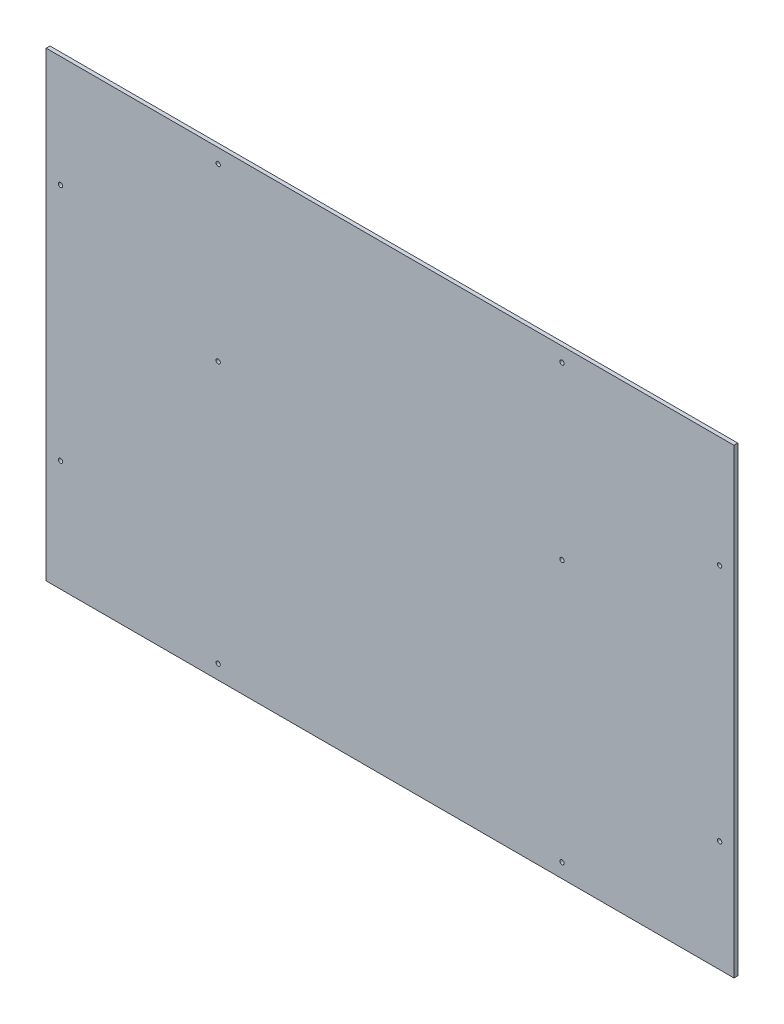
ISO-10303-21;
HEADER;
FILE_DESCRIPTION(('STEP AP214'),'2;1');
FILE_NAME('part.step','',(''),(''),'','','');
FILE_SCHEMA(('AUTOMOTIVE_DESIGN { 1 0 10303 214 1 1 1 1 }'));
ENDSEC;
DATA;
#1=APPLICATION_CONTEXT('core data for automotive mechanical design processes');
#2=APPLICATION_PROTOCOL_DEFINITION('international standard','automotive_design',2000,#1);
#3=PRODUCT_CONTEXT('',#1,'mechanical');
#4=PRODUCT('Part','Part','',(#3));
#5=PRODUCT_RELATED_PRODUCT_CATEGORY('part','',(#4));
#6=PRODUCT_DEFINITION_FORMATION('','',#4);
#7=PRODUCT_DEFINITION_CONTEXT('part definition',#1,'design');
#8=PRODUCT_DEFINITION('design','',#6,#7);
#9=PRODUCT_DEFINITION_SHAPE('','',#8);
#10=(LENGTH_UNIT() NAMED_UNIT(*) SI_UNIT(.MILLI.,.METRE.));
#11=(NAMED_UNIT(*) PLANE_ANGLE_UNIT() SI_UNIT($,.RADIAN.));
#12=(NAMED_UNIT(*) SI_UNIT($,.STERADIAN.) SOLID_ANGLE_UNIT());
#13=UNCERTAINTY_MEASURE_WITH_UNIT(LENGTH_MEASURE(1.E-05),#10,'distance_accuracy_value','');
#14=(GEOMETRIC_REPRESENTATION_CONTEXT(3) GLOBAL_UNCERTAINTY_ASSIGNED_CONTEXT((#13)) GLOBAL_UNIT_ASSIGNED_CONTEXT((#10,
#11,#12)) REPRESENTATION_CONTEXT('',''));
#15=CARTESIAN_POINT('',(0.,0.,0.));
#16=DIRECTION('',(0.,0.,1.));
#17=DIRECTION('',(1.,0.,0.));
#18=AXIS2_PLACEMENT_3D('',#15,#16,#17);
#19=CARTESIAN_POINT('',(-360.,0.,2.));
#20=DIRECTION('',(1.,0.,0.));
#21=DIRECTION('',(0.,1.,0.));
#22=AXIS2_PLACEMENT_3D('',#19,#20,#21);
#23=PLANE('',#22);
#24=DIRECTION('',(0.,-1.,0.));
#25=VECTOR('',#24,1.);
#26=CARTESIAN_POINT('',(-360.,0.,-2.));
#27=LINE('',#26,#25);
#28=CARTESIAN_POINT('',(-360.,0.,-2.));
#29=VERTEX_POINT('',#28);
#30=CARTESIAN_POINT('',(-360.,-483.,-2.));
#31=VERTEX_POINT('',#30);
#32=EDGE_CURVE('E100',#29,#31,#27,.T.);
#33=ORIENTED_EDGE('',*,*,#32,.T.);
#34=DIRECTION('',(0.,0.,-1.));
#35=VECTOR('',#34,1.);
#36=CARTESIAN_POINT('',(-360.,-483.,2.));
#37=LINE('',#36,#35);
#38=CARTESIAN_POINT('',(-360.,-483.,2.));
#39=VERTEX_POINT('',#38);
#40=EDGE_CURVE('E11',#39,#31,#37,.T.);
#41=ORIENTED_EDGE('',*,*,#40,.F.);
#42=DIRECTION('',(0.,-1.,0.));
#43=VECTOR('',#42,1.);
#44=CARTESIAN_POINT('',(-360.,0.,2.));
#45=LINE('',#44,#43);
#46=CARTESIAN_POINT('',(-360.,0.,2.));
#47=VERTEX_POINT('',#46);
#48=EDGE_CURVE('E88',#47,#39,#45,.T.);
#49=ORIENTED_EDGE('',*,*,#48,.F.);
#50=DIRECTION('',(0.,0.,-1.));
#51=VECTOR('',#50,1.);
#52=CARTESIAN_POINT('',(-360.,0.,2.));
#53=LINE('',#52,#51);
#54=EDGE_CURVE('E96',#47,#29,#53,.T.);
#55=ORIENTED_EDGE('',*,*,#54,.T.);
#56=EDGE_LOOP('',(#33,#41,#49,#55));
#57=FACE_BOUND('',#56,.T.);
#58=ADVANCED_FACE('F37',(#57),#23,.F.);
#59=CARTESIAN_POINT('',(-360.,-483.,2.));
#60=DIRECTION('',(0.,1.,0.));
#61=DIRECTION('',(0.,0.,1.));
#62=AXIS2_PLACEMENT_3D('',#59,#60,#61);
#63=PLANE('',#62);
#64=DIRECTION('',(1.,0.,0.));
#65=VECTOR('',#64,1.);
#66=CARTESIAN_POINT('',(-360.,-483.,-2.));
#67=LINE('',#66,#65);
#68=CARTESIAN_POINT('',(360.,-483.,-2.));
#69=VERTEX_POINT('',#68);
#70=EDGE_CURVE('E92',#31,#69,#67,.T.);
#71=ORIENTED_EDGE('',*,*,#70,.T.);
#72=DIRECTION('',(0.,0.,-1.));
#73=VECTOR('',#72,1.);
#74=CARTESIAN_POINT('',(360.,-483.,2.));
#75=LINE('',#74,#73);
#76=CARTESIAN_POINT('',(360.,-483.,2.));
#77=VERTEX_POINT('',#76);
#78=EDGE_CURVE('E45',#77,#69,#75,.T.);
#79=ORIENTED_EDGE('',*,*,#78,.F.);
#80=DIRECTION('',(1.,0.,0.));
#81=VECTOR('',#80,1.);
#82=CARTESIAN_POINT('',(-360.,-483.,2.));
#83=LINE('',#82,#81);
#84=EDGE_CURVE('E83',#39,#77,#83,.T.);
#85=ORIENTED_EDGE('',*,*,#84,.F.);
#86=ORIENTED_EDGE('',*,*,#40,.T.);
#87=EDGE_LOOP('',(#71,#79,#85,#86));
#88=FACE_BOUND('',#87,.T.);
#89=ADVANCED_FACE('F91',(#88),#63,.F.);
#90=CARTESIAN_POINT('',(360.,0.,2.));
#91=DIRECTION('',(-1.,0.,0.));
#92=DIRECTION('',(0.,-1.,0.));
#93=AXIS2_PLACEMENT_3D('',#90,#91,#92);
#94=PLANE('',#93);
#95=DIRECTION('',(0.,1.,0.));
#96=VECTOR('',#95,1.);
#97=CARTESIAN_POINT('',(360.,0.,-2.));
#98=LINE('',#97,#96);
#99=CARTESIAN_POINT('',(360.,0.,-2.));
#100=VERTEX_POINT('',#99);
#101=EDGE_CURVE('E70',#69,#100,#98,.T.);
#102=ORIENTED_EDGE('',*,*,#101,.T.);
#103=DIRECTION('',(0.,0.,-1.));
#104=VECTOR('',#103,1.);
#105=CARTESIAN_POINT('',(360.,0.,2.));
#106=LINE('',#105,#104);
#107=CARTESIAN_POINT('',(360.,0.,2.));
#108=VERTEX_POINT('',#107);
#109=EDGE_CURVE('E93',#108,#100,#106,.T.);
#110=ORIENTED_EDGE('',*,*,#109,.F.);
#111=DIRECTION('',(0.,1.,0.));
#112=VECTOR('',#111,1.);
#113=CARTESIAN_POINT('',(360.,0.,2.));
#114=LINE('',#113,#112);
#115=EDGE_CURVE('E86',#77,#108,#114,.T.);
#116=ORIENTED_EDGE('',*,*,#115,.F.);
#117=ORIENTED_EDGE('',*,*,#78,.T.);
#118=EDGE_LOOP('',(#102,#110,#116,#117));
#119=FACE_BOUND('',#118,.T.);
#120=ADVANCED_FACE('F94',(#119),#94,.F.);
#121=CARTESIAN_POINT('',(-360.,0.,2.));
#122=DIRECTION('',(0.,-1.,0.));
#123=DIRECTION('',(0.,0.,-1.));
#124=AXIS2_PLACEMENT_3D('',#121,#122,#123);
#125=PLANE('',#124);
#126=DIRECTION('',(-1.,0.,0.));
#127=VECTOR('',#126,1.);
#128=CARTESIAN_POINT('',(-360.,0.,-2.));
#129=LINE('',#128,#127);
#130=EDGE_CURVE('E76',#100,#29,#129,.T.);
#131=ORIENTED_EDGE('',*,*,#130,.T.);
#132=ORIENTED_EDGE('',*,*,#54,.F.);
#133=DIRECTION('',(-1.,0.,0.));
#134=VECTOR('',#133,1.);
#135=CARTESIAN_POINT('',(-360.,0.,2.));
#136=LINE('',#135,#134);
#137=EDGE_CURVE('E53',#108,#47,#136,.T.);
#138=ORIENTED_EDGE('',*,*,#137,.F.);
#139=ORIENTED_EDGE('',*,*,#109,.T.);
#140=EDGE_LOOP('',(#131,#132,#138,#139));
#141=FACE_BOUND('',#140,.T.);
#142=ADVANCED_FACE('F108',(#141),#125,.F.);
#143=CARTESIAN_POINT('',(0.,0.,2.));
#144=DIRECTION('',(0.,0.,1.));
#145=DIRECTION('',(1.,0.,0.));
#146=AXIS2_PLACEMENT_3D('',#143,#144,#145);
#147=PLANE('',#146);
#148=CARTESIAN_POINT('',(-180.,-468.,2.));
#149=DIRECTION('',(0.,0.,-1.));
#150=DIRECTION('',(1.,0.,0.));
#151=AXIS2_PLACEMENT_3D('',#148,#149,#150);
#152=CIRCLE('',#151,2.24999999999996);
#153=CARTESIAN_POINT('',(-177.75,-468.,2.));
#154=VERTEX_POINT('',#153);
#155=EDGE_CURVE('E165',#154,#154,#152,.T.);
#156=ORIENTED_EDGE('',*,*,#155,.T.);
#157=EDGE_LOOP('',(#156));
#158=FACE_BOUND('',#157,.T.);
#159=CARTESIAN_POINT('',(180.,-468.,2.));
#160=DIRECTION('',(0.,0.,-1.));
#161=DIRECTION('',(-1.,0.,0.));
#162=AXIS2_PLACEMENT_3D('',#159,#160,#161);
#163=CIRCLE('',#162,2.24999999999996);
#164=CARTESIAN_POINT('',(177.75,-468.,2.));
#165=VERTEX_POINT('',#164);
#166=EDGE_CURVE('E159',#165,#165,#163,.T.);
#167=ORIENTED_EDGE('',*,*,#166,.T.);
#168=EDGE_LOOP('',(#167));
#169=FACE_BOUND('',#168,.T.);
#170=CARTESIAN_POINT('',(-345.,-366.5,2.));
#171=DIRECTION('',(0.,0.,-1.));
#172=DIRECTION('',(1.,0.,0.));
#173=AXIS2_PLACEMENT_3D('',#170,#171,#172);
#174=CIRCLE('',#173,2.24999999999996);
#175=CARTESIAN_POINT('',(-342.75,-366.5,2.));
#176=VERTEX_POINT('',#175);
#177=EDGE_CURVE('E153',#176,#176,#174,.T.);
#178=ORIENTED_EDGE('',*,*,#177,.T.);
#179=EDGE_LOOP('',(#178));
#180=FACE_BOUND('',#179,.T.);
#181=CARTESIAN_POINT('',(345.,-366.5,2.));
#182=DIRECTION('',(0.,0.,-1.));
#183=DIRECTION('',(-1.,0.,0.));
#184=AXIS2_PLACEMENT_3D('',#181,#182,#183);
#185=CIRCLE('',#184,2.24999999999996);
#186=CARTESIAN_POINT('',(342.75,-366.5,2.));
#187=VERTEX_POINT('',#186);
#188=EDGE_CURVE('E147',#187,#187,#185,.T.);
#189=ORIENTED_EDGE('',*,*,#188,.T.);
#190=EDGE_LOOP('',(#189));
#191=FACE_BOUND('',#190,.T.);
#192=CARTESIAN_POINT('',(-180.,-14.9999999999999,2.));
#193=DIRECTION('',(0.,0.,-1.));
#194=DIRECTION('',(1.,0.,0.));
#195=AXIS2_PLACEMENT_3D('',#192,#193,#194);
#196=CIRCLE('',#195,2.24999999999995);
#197=CARTESIAN_POINT('',(-177.75,-14.9999999999999,2.));
#198=VERTEX_POINT('',#197);
#199=EDGE_CURVE('E141',#198,#198,#196,.T.);
#200=ORIENTED_EDGE('',*,*,#199,.T.);
#201=EDGE_LOOP('',(#200));
#202=FACE_BOUND('',#201,.T.);
#203=CARTESIAN_POINT('',(-345.,-116.5,2.));
#204=DIRECTION('',(0.,0.,-1.));
#205=DIRECTION('',(1.,0.,0.));
#206=AXIS2_PLACEMENT_3D('',#203,#204,#205);
#207=CIRCLE('',#206,2.24999999999995);
#208=CARTESIAN_POINT('',(-342.75,-116.5,2.));
#209=VERTEX_POINT('',#208);
#210=EDGE_CURVE('E135',#209,#209,#207,.T.);
#211=ORIENTED_EDGE('',*,*,#210,.T.);
#212=EDGE_LOOP('',(#211));
#213=FACE_BOUND('',#212,.T.);
#214=CARTESIAN_POINT('',(-180.,-194.,2.));
#215=DIRECTION('',(0.,0.,-1.));
#216=DIRECTION('',(1.,0.,0.));
#217=AXIS2_PLACEMENT_3D('',#214,#215,#216);
#218=CIRCLE('',#217,2.24999999999995);
#219=CARTESIAN_POINT('',(-177.75,-194.,2.));
#220=VERTEX_POINT('',#219);
#221=EDGE_CURVE('E129',#220,#220,#218,.T.);
#222=ORIENTED_EDGE('',*,*,#221,.T.);
#223=EDGE_LOOP('',(#222));
#224=FACE_BOUND('',#223,.T.);
#225=CARTESIAN_POINT('',(180.,-194.,2.));
#226=DIRECTION('',(0.,0.,-1.));
#227=DIRECTION('',(-1.,0.,0.));
#228=AXIS2_PLACEMENT_3D('',#225,#226,#227);
#229=CIRCLE('',#228,2.24999999999995);
#230=CARTESIAN_POINT('',(177.75,-194.,2.));
#231=VERTEX_POINT('',#230);
#232=EDGE_CURVE('E123',#231,#231,#229,.T.);
#233=ORIENTED_EDGE('',*,*,#232,.T.);
#234=EDGE_LOOP('',(#233));
#235=FACE_BOUND('',#234,.T.);
#236=CARTESIAN_POINT('',(180.,-14.9999999999999,2.));
#237=DIRECTION('',(0.,0.,-1.));
#238=DIRECTION('',(-1.,0.,0.));
#239=AXIS2_PLACEMENT_3D('',#236,#237,#238);
#240=CIRCLE('',#239,2.24999999999995);
#241=CARTESIAN_POINT('',(177.75,-14.9999999999999,2.));
#242=VERTEX_POINT('',#241);
#243=EDGE_CURVE('E117',#242,#242,#240,.T.);
#244=ORIENTED_EDGE('',*,*,#243,.T.);
#245=EDGE_LOOP('',(#244));
#246=FACE_BOUND('',#245,.T.);
#247=CARTESIAN_POINT('',(345.,-116.5,2.));
#248=DIRECTION('',(0.,0.,-1.));
#249=DIRECTION('',(-1.,0.,0.));
#250=AXIS2_PLACEMENT_3D('',#247,#248,#249);
#251=CIRCLE('',#250,2.24999999999995);
#252=CARTESIAN_POINT('',(342.75,-116.5,2.));
#253=VERTEX_POINT('',#252);
#254=EDGE_CURVE('E103',#253,#253,#251,.T.);
#255=ORIENTED_EDGE('',*,*,#254,.T.);
#256=EDGE_LOOP('',(#255));
#257=FACE_BOUND('',#256,.T.);
#258=ORIENTED_EDGE('',*,*,#48,.T.);
#259=ORIENTED_EDGE('',*,*,#84,.T.);
#260=ORIENTED_EDGE('',*,*,#115,.T.);
#261=ORIENTED_EDGE('',*,*,#137,.T.);
#262=EDGE_LOOP('',(#258,#259,#260,#261));
#263=FACE_BOUND('',#262,.T.);
#264=ADVANCED_FACE('F84',(#158,#169,#180,#191,#202,#213,#224,#235,#246,#257,#263),#147,.T.);
#265=CARTESIAN_POINT('',(0.,0.,-2.));
#266=DIRECTION('',(0.,0.,1.));
#267=DIRECTION('',(1.,0.,0.));
#268=AXIS2_PLACEMENT_3D('',#265,#266,#267);
#269=PLANE('',#268);
#270=CARTESIAN_POINT('',(-180.,-468.,-2.));
#271=DIRECTION('',(0.,0.,-1.));
#272=DIRECTION('',(1.,0.,0.));
#273=AXIS2_PLACEMENT_3D('',#270,#271,#272);
#274=CIRCLE('',#273,2.24999999999996);
#275=CARTESIAN_POINT('',(-177.75,-468.,-2.));
#276=VERTEX_POINT('',#275);
#277=EDGE_CURVE('E168',#276,#276,#274,.T.);
#278=ORIENTED_EDGE('',*,*,#277,.F.);
#279=EDGE_LOOP('',(#278));
#280=FACE_BOUND('',#279,.T.);
#281=CARTESIAN_POINT('',(180.,-468.,-2.));
#282=DIRECTION('',(0.,0.,-1.));
#283=DIRECTION('',(-1.,0.,0.));
#284=AXIS2_PLACEMENT_3D('',#281,#282,#283);
#285=CIRCLE('',#284,2.24999999999996);
#286=CARTESIAN_POINT('',(177.75,-468.,-2.));
#287=VERTEX_POINT('',#286);
#288=EDGE_CURVE('E162',#287,#287,#285,.T.);
#289=ORIENTED_EDGE('',*,*,#288,.F.);
#290=EDGE_LOOP('',(#289));
#291=FACE_BOUND('',#290,.T.);
#292=CARTESIAN_POINT('',(-345.,-366.5,-2.));
#293=DIRECTION('',(0.,0.,-1.));
#294=DIRECTION('',(1.,0.,0.));
#295=AXIS2_PLACEMENT_3D('',#292,#293,#294);
#296=CIRCLE('',#295,2.24999999999996);
#297=CARTESIAN_POINT('',(-342.75,-366.5,-2.));
#298=VERTEX_POINT('',#297);
#299=EDGE_CURVE('E156',#298,#298,#296,.T.);
#300=ORIENTED_EDGE('',*,*,#299,.F.);
#301=EDGE_LOOP('',(#300));
#302=FACE_BOUND('',#301,.T.);
#303=CARTESIAN_POINT('',(345.,-366.5,-2.));
#304=DIRECTION('',(0.,0.,-1.));
#305=DIRECTION('',(-1.,0.,0.));
#306=AXIS2_PLACEMENT_3D('',#303,#304,#305);
#307=CIRCLE('',#306,2.24999999999996);
#308=CARTESIAN_POINT('',(342.75,-366.5,-2.));
#309=VERTEX_POINT('',#308);
#310=EDGE_CURVE('E150',#309,#309,#307,.T.);
#311=ORIENTED_EDGE('',*,*,#310,.F.);
#312=EDGE_LOOP('',(#311));
#313=FACE_BOUND('',#312,.T.);
#314=CARTESIAN_POINT('',(-180.,-14.9999999999999,-2.));
#315=DIRECTION('',(0.,0.,-1.));
#316=DIRECTION('',(1.,0.,0.));
#317=AXIS2_PLACEMENT_3D('',#314,#315,#316);
#318=CIRCLE('',#317,2.24999999999995);
#319=CARTESIAN_POINT('',(-177.75,-14.9999999999999,-2.));
#320=VERTEX_POINT('',#319);
#321=EDGE_CURVE('E144',#320,#320,#318,.T.);
#322=ORIENTED_EDGE('',*,*,#321,.F.);
#323=EDGE_LOOP('',(#322));
#324=FACE_BOUND('',#323,.T.);
#325=CARTESIAN_POINT('',(-345.,-116.5,-2.));
#326=DIRECTION('',(0.,0.,-1.));
#327=DIRECTION('',(1.,0.,0.));
#328=AXIS2_PLACEMENT_3D('',#325,#326,#327);
#329=CIRCLE('',#328,2.24999999999995);
#330=CARTESIAN_POINT('',(-342.75,-116.5,-2.));
#331=VERTEX_POINT('',#330);
#332=EDGE_CURVE('E138',#331,#331,#329,.T.);
#333=ORIENTED_EDGE('',*,*,#332,.F.);
#334=EDGE_LOOP('',(#333));
#335=FACE_BOUND('',#334,.T.);
#336=CARTESIAN_POINT('',(-180.,-194.,-2.));
#337=DIRECTION('',(0.,0.,-1.));
#338=DIRECTION('',(1.,0.,0.));
#339=AXIS2_PLACEMENT_3D('',#336,#337,#338);
#340=CIRCLE('',#339,2.24999999999995);
#341=CARTESIAN_POINT('',(-177.75,-194.,-2.));
#342=VERTEX_POINT('',#341);
#343=EDGE_CURVE('E132',#342,#342,#340,.T.);
#344=ORIENTED_EDGE('',*,*,#343,.F.);
#345=EDGE_LOOP('',(#344));
#346=FACE_BOUND('',#345,.T.);
#347=CARTESIAN_POINT('',(180.,-194.,-2.));
#348=DIRECTION('',(0.,0.,-1.));
#349=DIRECTION('',(-1.,0.,0.));
#350=AXIS2_PLACEMENT_3D('',#347,#348,#349);
#351=CIRCLE('',#350,2.24999999999995);
#352=CARTESIAN_POINT('',(177.75,-194.,-2.));
#353=VERTEX_POINT('',#352);
#354=EDGE_CURVE('E126',#353,#353,#351,.T.);
#355=ORIENTED_EDGE('',*,*,#354,.F.);
#356=EDGE_LOOP('',(#355));
#357=FACE_BOUND('',#356,.T.);
#358=CARTESIAN_POINT('',(180.,-14.9999999999999,-2.));
#359=DIRECTION('',(0.,0.,-1.));
#360=DIRECTION('',(-1.,0.,0.));
#361=AXIS2_PLACEMENT_3D('',#358,#359,#360);
#362=CIRCLE('',#361,2.24999999999995);
#363=CARTESIAN_POINT('',(177.75,-14.9999999999999,-2.));
#364=VERTEX_POINT('',#363);
#365=EDGE_CURVE('E120',#364,#364,#362,.T.);
#366=ORIENTED_EDGE('',*,*,#365,.F.);
#367=EDGE_LOOP('',(#366));
#368=FACE_BOUND('',#367,.T.);
#369=CARTESIAN_POINT('',(345.,-116.5,-2.));
#370=DIRECTION('',(0.,0.,-1.));
#371=DIRECTION('',(-1.,0.,0.));
#372=AXIS2_PLACEMENT_3D('',#369,#370,#371);
#373=CIRCLE('',#372,2.24999999999995);
#374=CARTESIAN_POINT('',(342.75,-116.5,-2.));
#375=VERTEX_POINT('',#374);
#376=EDGE_CURVE('E114',#375,#375,#373,.T.);
#377=ORIENTED_EDGE('',*,*,#376,.F.);
#378=EDGE_LOOP('',(#377));
#379=FACE_BOUND('',#378,.T.);
#380=ORIENTED_EDGE('',*,*,#32,.F.);
#381=ORIENTED_EDGE('',*,*,#130,.F.);
#382=ORIENTED_EDGE('',*,*,#101,.F.);
#383=ORIENTED_EDGE('',*,*,#70,.F.);
#384=EDGE_LOOP('',(#380,#381,#382,#383));
#385=FACE_BOUND('',#384,.T.);
#386=ADVANCED_FACE('F111',(#280,#291,#302,#313,#324,#335,#346,#357,#368,#379,#385),#269,.F.);
#387=CARTESIAN_POINT('',(345.,-116.5,2.));
#388=DIRECTION('',(0.,0.,-1.));
#389=DIRECTION('',(-1.,0.,0.));
#390=AXIS2_PLACEMENT_3D('',#387,#388,#389);
#391=CYLINDRICAL_SURFACE('',#390,2.24999999999995);
#392=ORIENTED_EDGE('',*,*,#254,.F.);
#393=EDGE_LOOP('',(#392));
#394=FACE_BOUND('',#393,.T.);
#395=ORIENTED_EDGE('',*,*,#376,.T.);
#396=EDGE_LOOP('',(#395));
#397=FACE_BOUND('',#396,.T.);
#398=ADVANCED_FACE('F185',(#394,#397),#391,.F.);
#399=CARTESIAN_POINT('',(180.,-14.9999999999999,2.));
#400=DIRECTION('',(0.,0.,-1.));
#401=DIRECTION('',(-1.,0.,0.));
#402=AXIS2_PLACEMENT_3D('',#399,#400,#401);
#403=CYLINDRICAL_SURFACE('',#402,2.24999999999995);
#404=ORIENTED_EDGE('',*,*,#243,.F.);
#405=EDGE_LOOP('',(#404));
#406=FACE_BOUND('',#405,.T.);
#407=ORIENTED_EDGE('',*,*,#365,.T.);
#408=EDGE_LOOP('',(#407));
#409=FACE_BOUND('',#408,.T.);
#410=ADVANCED_FACE('F206',(#406,#409),#403,.F.);
#411=CARTESIAN_POINT('',(180.,-194.,2.));
#412=DIRECTION('',(0.,0.,-1.));
#413=DIRECTION('',(-1.,0.,0.));
#414=AXIS2_PLACEMENT_3D('',#411,#412,#413);
#415=CYLINDRICAL_SURFACE('',#414,2.24999999999995);
#416=ORIENTED_EDGE('',*,*,#232,.F.);
#417=EDGE_LOOP('',(#416));
#418=FACE_BOUND('',#417,.T.);
#419=ORIENTED_EDGE('',*,*,#354,.T.);
#420=EDGE_LOOP('',(#419));
#421=FACE_BOUND('',#420,.T.);
#422=ADVANCED_FACE('F212',(#418,#421),#415,.F.);
#423=CARTESIAN_POINT('',(-180.,-194.,2.));
#424=DIRECTION('',(0.,0.,-1.));
#425=DIRECTION('',(-1.,0.,0.));
#426=AXIS2_PLACEMENT_3D('',#423,#424,#425);
#427=CYLINDRICAL_SURFACE('',#426,2.24999999999995);
#428=ORIENTED_EDGE('',*,*,#221,.F.);
#429=EDGE_LOOP('',(#428));
#430=FACE_BOUND('',#429,.T.);
#431=ORIENTED_EDGE('',*,*,#343,.T.);
#432=EDGE_LOOP('',(#431));
#433=FACE_BOUND('',#432,.T.);
#434=ADVANCED_FACE('F255',(#430,#433),#427,.F.);
#435=CARTESIAN_POINT('',(-345.,-116.5,2.));
#436=DIRECTION('',(0.,0.,-1.));
#437=DIRECTION('',(-1.,0.,0.));
#438=AXIS2_PLACEMENT_3D('',#435,#436,#437);
#439=CYLINDRICAL_SURFACE('',#438,2.24999999999995);
#440=ORIENTED_EDGE('',*,*,#210,.F.);
#441=EDGE_LOOP('',(#440));
#442=FACE_BOUND('',#441,.T.);
#443=ORIENTED_EDGE('',*,*,#332,.T.);
#444=EDGE_LOOP('',(#443));
#445=FACE_BOUND('',#444,.T.);
#446=ADVANCED_FACE('F265',(#442,#445),#439,.F.);
#447=CARTESIAN_POINT('',(-180.,-14.9999999999999,2.));
#448=DIRECTION('',(0.,0.,-1.));
#449=DIRECTION('',(-1.,0.,0.));
#450=AXIS2_PLACEMENT_3D('',#447,#448,#449);
#451=CYLINDRICAL_SURFACE('',#450,2.24999999999995);
#452=ORIENTED_EDGE('',*,*,#199,.F.);
#453=EDGE_LOOP('',(#452));
#454=FACE_BOUND('',#453,.T.);
#455=ORIENTED_EDGE('',*,*,#321,.T.);
#456=EDGE_LOOP('',(#455));
#457=FACE_BOUND('',#456,.T.);
#458=ADVANCED_FACE('F275',(#454,#457),#451,.F.);
#459=CARTESIAN_POINT('',(345.,-366.5,2.));
#460=DIRECTION('',(0.,0.,-1.));
#461=DIRECTION('',(-1.,0.,0.));
#462=AXIS2_PLACEMENT_3D('',#459,#460,#461);
#463=CYLINDRICAL_SURFACE('',#462,2.24999999999996);
#464=ORIENTED_EDGE('',*,*,#188,.F.);
#465=EDGE_LOOP('',(#464));
#466=FACE_BOUND('',#465,.T.);
#467=ORIENTED_EDGE('',*,*,#310,.T.);
#468=EDGE_LOOP('',(#467));
#469=FACE_BOUND('',#468,.T.);
#470=ADVANCED_FACE('F285',(#466,#469),#463,.F.);
#471=CARTESIAN_POINT('',(-345.,-366.5,2.));
#472=DIRECTION('',(0.,0.,-1.));
#473=DIRECTION('',(-1.,0.,0.));
#474=AXIS2_PLACEMENT_3D('',#471,#472,#473);
#475=CYLINDRICAL_SURFACE('',#474,2.24999999999996);
#476=ORIENTED_EDGE('',*,*,#177,.F.);
#477=EDGE_LOOP('',(#476));
#478=FACE_BOUND('',#477,.T.);
#479=ORIENTED_EDGE('',*,*,#299,.T.);
#480=EDGE_LOOP('',(#479));
#481=FACE_BOUND('',#480,.T.);
#482=ADVANCED_FACE('F295',(#478,#481),#475,.F.);
#483=CARTESIAN_POINT('',(180.,-468.,2.));
#484=DIRECTION('',(0.,0.,-1.));
#485=DIRECTION('',(-1.,0.,0.));
#486=AXIS2_PLACEMENT_3D('',#483,#484,#485);
#487=CYLINDRICAL_SURFACE('',#486,2.24999999999996);
#488=ORIENTED_EDGE('',*,*,#166,.F.);
#489=EDGE_LOOP('',(#488));
#490=FACE_BOUND('',#489,.T.);
#491=ORIENTED_EDGE('',*,*,#288,.T.);
#492=EDGE_LOOP('',(#491));
#493=FACE_BOUND('',#492,.T.);
#494=ADVANCED_FACE('F179',(#490,#493),#487,.F.);
#495=CARTESIAN_POINT('',(-180.,-468.,2.));
#496=DIRECTION('',(0.,0.,-1.));
#497=DIRECTION('',(-1.,0.,0.));
#498=AXIS2_PLACEMENT_3D('',#495,#496,#497);
#499=CYLINDRICAL_SURFACE('',#498,2.24999999999996);
#500=ORIENTED_EDGE('',*,*,#155,.F.);
#501=EDGE_LOOP('',(#500));
#502=FACE_BOUND('',#501,.T.);
#503=ORIENTED_EDGE('',*,*,#277,.T.);
#504=EDGE_LOOP('',(#503));
#505=FACE_BOUND('',#504,.T.);
#506=ADVANCED_FACE('F176',(#502,#505),#499,.F.);
#507=CLOSED_SHELL('',(#58,#89,#120,#142,#264,#386,#398,#410,#422,#434,#446,#458,#470,#482,#494,#506));
#508=MANIFOLD_SOLID_BREP('B2',#507);
#509=ADVANCED_BREP_SHAPE_REPRESENTATION('',(#18,#508),#14);
#510=SHAPE_DEFINITION_REPRESENTATION(#9,#509);
ENDSEC;
END-ISO-10303-21;
